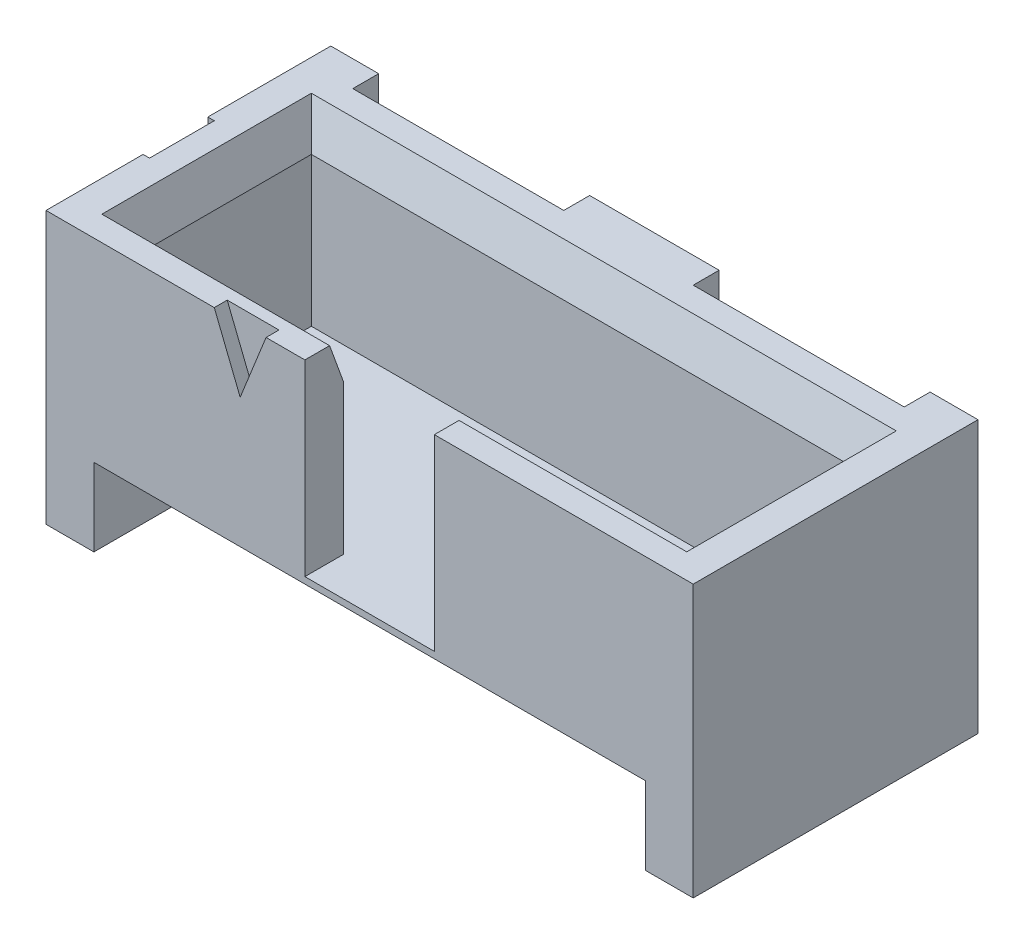
ISO-10303-21;
HEADER;
FILE_DESCRIPTION(('STEP AP214'),'2;1');
FILE_NAME('part.step','',(''),(''),'','','');
FILE_SCHEMA(('AUTOMOTIVE_DESIGN { 1 0 10303 214 1 1 1 1 }'));
ENDSEC;
DATA;
#1=APPLICATION_CONTEXT('core data for automotive mechanical design processes');
#2=APPLICATION_PROTOCOL_DEFINITION('international standard','automotive_design',2000,#1);
#3=PRODUCT_CONTEXT('',#1,'mechanical');
#4=PRODUCT('Part','Part','',(#3));
#5=PRODUCT_RELATED_PRODUCT_CATEGORY('part','',(#4));
#6=PRODUCT_DEFINITION_FORMATION('','',#4);
#7=PRODUCT_DEFINITION_CONTEXT('part definition',#1,'design');
#8=PRODUCT_DEFINITION('design','',#6,#7);
#9=PRODUCT_DEFINITION_SHAPE('','',#8);
#10=(LENGTH_UNIT() NAMED_UNIT(*) SI_UNIT(.MILLI.,.METRE.));
#11=(NAMED_UNIT(*) PLANE_ANGLE_UNIT() SI_UNIT($,.RADIAN.));
#12=(NAMED_UNIT(*) SI_UNIT($,.STERADIAN.) SOLID_ANGLE_UNIT());
#13=UNCERTAINTY_MEASURE_WITH_UNIT(LENGTH_MEASURE(1.E-05),#10,'distance_accuracy_value','');
#14=(GEOMETRIC_REPRESENTATION_CONTEXT(3) GLOBAL_UNCERTAINTY_ASSIGNED_CONTEXT((#13)) GLOBAL_UNIT_ASSIGNED_CONTEXT((#10,
#11,#12)) REPRESENTATION_CONTEXT('',''));
#15=CARTESIAN_POINT('',(0.,0.,0.));
#16=DIRECTION('',(0.,0.,1.));
#17=DIRECTION('',(1.,0.,0.));
#18=AXIS2_PLACEMENT_3D('',#15,#16,#17);
#19=CARTESIAN_POINT('',(-6.35,5.334,2.54));
#20=DIRECTION('',(1.,0.,0.));
#21=DIRECTION('',(0.,0.,-1.));
#22=AXIS2_PLACEMENT_3D('',#19,#20,#21);
#23=PLANE('',#22);
#24=DIRECTION('',(0.,0.,-1.));
#25=VECTOR('',#24,1.);
#26=CARTESIAN_POINT('',(-6.35,5.334,2.54));
#27=LINE('',#26,#25);
#28=CARTESIAN_POINT('',(-6.35,5.334,2.54));
#29=VERTEX_POINT('',#28);
#30=CARTESIAN_POINT('',(-6.35,5.334,0.635));
#31=VERTEX_POINT('',#30);
#32=EDGE_CURVE('E333',#29,#31,#27,.T.);
#33=ORIENTED_EDGE('',*,*,#32,.T.);
#34=DIRECTION('',(0.,-1.,0.));
#35=VECTOR('',#34,1.);
#36=CARTESIAN_POINT('',(-6.35,5.334,0.635));
#37=LINE('',#36,#35);
#38=CARTESIAN_POINT('',(-6.35,0.,0.635));
#39=VERTEX_POINT('',#38);
#40=EDGE_CURVE('E11',#31,#39,#37,.T.);
#41=ORIENTED_EDGE('',*,*,#40,.T.);
#42=DIRECTION('',(0.,0.,-1.));
#43=VECTOR('',#42,1.);
#44=CARTESIAN_POINT('',(-6.35,0.,2.54));
#45=LINE('',#44,#43);
#46=CARTESIAN_POINT('',(-6.35,0.,2.54));
#47=VERTEX_POINT('',#46);
#48=EDGE_CURVE('E329',#47,#39,#45,.T.);
#49=ORIENTED_EDGE('',*,*,#48,.F.);
#50=DIRECTION('',(0.,-1.,0.));
#51=VECTOR('',#50,1.);
#52=CARTESIAN_POINT('',(-6.35,5.334,2.54));
#53=LINE('',#52,#51);
#54=EDGE_CURVE('E310',#29,#47,#53,.T.);
#55=ORIENTED_EDGE('',*,*,#54,.F.);
#56=EDGE_LOOP('',(#33,#41,#49,#55));
#57=FACE_BOUND('',#56,.T.);
#58=ADVANCED_FACE('F33',(#57),#23,.F.);
#59=CARTESIAN_POINT('',(0.,0.,-3.048));
#60=DIRECTION('',(0.,0.,1.));
#61=DIRECTION('',(1.,0.,0.));
#62=AXIS2_PLACEMENT_3D('',#59,#60,#61);
#63=PLANE('',#62);
#64=DIRECTION('',(0.,1.,0.));
#65=VECTOR('',#64,1.);
#66=CARTESIAN_POINT('',(5.4102,0.,-3.048));
#67=LINE('',#66,#65);
#68=CARTESIAN_POINT('',(5.4102,0.,-3.048));
#69=VERTEX_POINT('',#68);
#70=CARTESIAN_POINT('',(5.4102,5.334,-3.048));
#71=VERTEX_POINT('',#70);
#72=EDGE_CURVE('E255',#69,#71,#67,.T.);
#73=ORIENTED_EDGE('',*,*,#72,.T.);
#74=DIRECTION('',(-1.,0.,0.));
#75=VECTOR('',#74,1.);
#76=CARTESIAN_POINT('',(6.35,5.334,-3.048));
#77=LINE('',#76,#75);
#78=CARTESIAN_POINT('',(6.35,5.334,-3.048));
#79=VERTEX_POINT('',#78);
#80=EDGE_CURVE('E260',#79,#71,#77,.T.);
#81=ORIENTED_EDGE('',*,*,#80,.F.);
#82=DIRECTION('',(0.,1.,0.));
#83=VECTOR('',#82,1.);
#84=CARTESIAN_POINT('',(6.35,0.,-3.048));
#85=LINE('',#84,#83);
#86=CARTESIAN_POINT('',(6.35,0.,-3.048));
#87=VERTEX_POINT('',#86);
#88=EDGE_CURVE('E326',#87,#79,#85,.T.);
#89=ORIENTED_EDGE('',*,*,#88,.F.);
#90=DIRECTION('',(1.,0.,0.));
#91=VECTOR('',#90,1.);
#92=CARTESIAN_POINT('',(-6.35,0.,-3.048));
#93=LINE('',#92,#91);
#94=EDGE_CURVE('E261',#69,#87,#93,.T.);
#95=ORIENTED_EDGE('',*,*,#94,.F.);
#96=EDGE_LOOP('',(#73,#81,#89,#95));
#97=FACE_BOUND('',#96,.T.);
#98=ADVANCED_FACE('F257',(#97),#63,.F.);
#99=CARTESIAN_POINT('',(1.27,5.334,-3.048));
#100=VERTEX_POINT('',#99);
#101=CARTESIAN_POINT('',(-1.27,5.334,-3.048));
#102=VERTEX_POINT('',#101);
#103=EDGE_CURVE('E282',#100,#102,#77,.T.);
#104=ORIENTED_EDGE('',*,*,#103,.F.);
#105=DIRECTION('',(0.,-1.,0.));
#106=VECTOR('',#105,1.);
#107=CARTESIAN_POINT('',(1.27,5.334,-3.048));
#108=LINE('',#107,#106);
#109=CARTESIAN_POINT('',(1.27,2.032,-3.048));
#110=VERTEX_POINT('',#109);
#111=EDGE_CURVE('E375',#100,#110,#108,.T.);
#112=ORIENTED_EDGE('',*,*,#111,.T.);
#113=DIRECTION('',(-1.,0.,0.));
#114=VECTOR('',#113,1.);
#115=CARTESIAN_POINT('',(5.4102,2.032,-3.048));
#116=LINE('',#115,#114);
#117=CARTESIAN_POINT('',(-1.27,2.032,-3.048));
#118=VERTEX_POINT('',#117);
#119=EDGE_CURVE('E295',#110,#118,#116,.T.);
#120=ORIENTED_EDGE('',*,*,#119,.T.);
#121=DIRECTION('',(0.,-1.,0.));
#122=VECTOR('',#121,1.);
#123=CARTESIAN_POINT('',(-1.27,5.334,-3.048));
#124=LINE('',#123,#122);
#125=EDGE_CURVE('E373',#102,#118,#124,.T.);
#126=ORIENTED_EDGE('',*,*,#125,.F.);
#127=EDGE_LOOP('',(#104,#112,#120,#126));
#128=FACE_BOUND('',#127,.T.);
#129=ADVANCED_FACE('F537',(#128),#63,.F.);
#130=CARTESIAN_POINT('',(6.35,5.334,2.54));
#131=DIRECTION('',(0.,-1.,0.));
#132=DIRECTION('',(0.,0.,-1.));
#133=AXIS2_PLACEMENT_3D('',#130,#131,#132);
#134=PLANE('',#133);
#135=ORIENTED_EDGE('',*,*,#80,.T.);
#136=DIRECTION('',(0.,0.,1.));
#137=VECTOR('',#136,1.);
#138=CARTESIAN_POINT('',(5.4102,5.334,-3.048));
#139=LINE('',#138,#137);
#140=CARTESIAN_POINT('',(5.4102,5.334,-2.54));
#141=VERTEX_POINT('',#140);
#142=EDGE_CURVE('E267',#71,#141,#139,.T.);
#143=ORIENTED_EDGE('',*,*,#142,.T.);
#144=DIRECTION('',(-1.,0.,0.));
#145=VECTOR('',#144,1.);
#146=CARTESIAN_POINT('',(5.4102,5.334,-2.54));
#147=LINE('',#146,#145);
#148=CARTESIAN_POINT('',(1.27,5.334,-2.54));
#149=VERTEX_POINT('',#148);
#150=EDGE_CURVE('E274',#141,#149,#147,.T.);
#151=ORIENTED_EDGE('',*,*,#150,.T.);
#152=DIRECTION('',(0.,0.,-1.));
#153=VECTOR('',#152,1.);
#154=CARTESIAN_POINT('',(1.27,5.334,-2.54));
#155=LINE('',#154,#153);
#156=EDGE_CURVE('E540',#149,#100,#155,.T.);
#157=ORIENTED_EDGE('',*,*,#156,.T.);
#158=ORIENTED_EDGE('',*,*,#103,.T.);
#159=DIRECTION('',(0.,0.,1.));
#160=VECTOR('',#159,1.);
#161=CARTESIAN_POINT('',(-1.27,5.334,-3.048));
#162=LINE('',#161,#160);
#163=CARTESIAN_POINT('',(-1.27,5.334,-2.54));
#164=VERTEX_POINT('',#163);
#165=EDGE_CURVE('E542',#102,#164,#162,.T.);
#166=ORIENTED_EDGE('',*,*,#165,.T.);
#167=DIRECTION('',(-1.,0.,0.));
#168=VECTOR('',#167,1.);
#169=CARTESIAN_POINT('',(-1.27,5.334,-2.54));
#170=LINE('',#169,#168);
#171=CARTESIAN_POINT('',(-5.4102,5.334,-2.54));
#172=VERTEX_POINT('',#171);
#173=EDGE_CURVE('E353',#164,#172,#170,.T.);
#174=ORIENTED_EDGE('',*,*,#173,.T.);
#175=DIRECTION('',(0.,0.,-1.));
#176=VECTOR('',#175,1.);
#177=CARTESIAN_POINT('',(-5.4102,5.334,-2.54));
#178=LINE('',#177,#176);
#179=CARTESIAN_POINT('',(-5.4102,5.334,-3.048));
#180=VERTEX_POINT('',#179);
#181=EDGE_CURVE('E349',#172,#180,#178,.T.);
#182=ORIENTED_EDGE('',*,*,#181,.T.);
#183=CARTESIAN_POINT('',(-6.35,5.334,-3.048));
#184=VERTEX_POINT('',#183);
#185=EDGE_CURVE('E284',#180,#184,#77,.T.);
#186=ORIENTED_EDGE('',*,*,#185,.T.);
#187=CARTESIAN_POINT('',(-6.35,5.334,-0.635));
#188=VERTEX_POINT('',#187);
#189=EDGE_CURVE('E332',#188,#184,#27,.T.);
#190=ORIENTED_EDGE('',*,*,#189,.F.);
#191=DIRECTION('',(1.,0.,0.));
#192=VECTOR('',#191,1.);
#193=CARTESIAN_POINT('',(-6.604,5.334,-0.635));
#194=LINE('',#193,#192);
#195=CARTESIAN_POINT('',(-6.223,5.334,-0.635));
#196=VERTEX_POINT('',#195);
#197=EDGE_CURVE('E48',#188,#196,#194,.T.);
#198=ORIENTED_EDGE('',*,*,#197,.T.);
#199=DIRECTION('',(0.,0.,1.));
#200=VECTOR('',#199,1.);
#201=CARTESIAN_POINT('',(-6.223,5.334,-0.635));
#202=LINE('',#201,#200);
#203=CARTESIAN_POINT('',(-6.223,5.334,0.635));
#204=VERTEX_POINT('',#203);
#205=EDGE_CURVE('E348',#196,#204,#202,.T.);
#206=ORIENTED_EDGE('',*,*,#205,.T.);
#207=DIRECTION('',(-1.,0.,0.));
#208=VECTOR('',#207,1.);
#209=CARTESIAN_POINT('',(-6.223,5.334,0.635));
#210=LINE('',#209,#208);
#211=EDGE_CURVE('E275',#204,#31,#210,.T.);
#212=ORIENTED_EDGE('',*,*,#211,.T.);
#213=ORIENTED_EDGE('',*,*,#32,.F.);
#214=DIRECTION('',(-1.,0.,0.));
#215=VECTOR('',#214,1.);
#216=CARTESIAN_POINT('',(6.35,5.334,2.54));
#217=LINE('',#216,#215);
#218=CARTESIAN_POINT('',(-3.048,5.334,2.54));
#219=VERTEX_POINT('',#218);
#220=EDGE_CURVE('E312',#219,#29,#217,.T.);
#221=ORIENTED_EDGE('',*,*,#220,.F.);
#222=DIRECTION('',(0.,0.,1.));
#223=VECTOR('',#222,1.);
#224=CARTESIAN_POINT('',(-3.048,5.334,2.286));
#225=LINE('',#224,#223);
#226=CARTESIAN_POINT('',(-3.048,5.334,2.286));
#227=VERTEX_POINT('',#226);
#228=EDGE_CURVE('E423',#227,#219,#225,.T.);
#229=ORIENTED_EDGE('',*,*,#228,.F.);
#230=DIRECTION('',(-1.,0.,0.));
#231=VECTOR('',#230,1.);
#232=CARTESIAN_POINT('',(-2.032,5.334,2.286));
#233=LINE('',#232,#231);
#234=CARTESIAN_POINT('',(-2.032,5.334,2.286));
#235=VERTEX_POINT('',#234);
#236=EDGE_CURVE('E413',#235,#227,#233,.T.);
#237=ORIENTED_EDGE('',*,*,#236,.F.);
#238=DIRECTION('',(0.,0.,1.));
#239=VECTOR('',#238,1.);
#240=CARTESIAN_POINT('',(-2.032,5.334,2.286));
#241=LINE('',#240,#239);
#242=CARTESIAN_POINT('',(-2.032,5.334,2.54));
#243=VERTEX_POINT('',#242);
#244=EDGE_CURVE('E427',#235,#243,#241,.T.);
#245=ORIENTED_EDGE('',*,*,#244,.T.);
#246=CARTESIAN_POINT('',(-1.27,5.334,2.54));
#247=VERTEX_POINT('',#246);
#248=EDGE_CURVE('E311',#247,#243,#217,.T.);
#249=ORIENTED_EDGE('',*,*,#248,.F.);
#250=DIRECTION('',(0.,0.,-1.));
#251=VECTOR('',#250,1.);
#252=CARTESIAN_POINT('',(-1.27,5.334,2.54));
#253=LINE('',#252,#251);
#254=CARTESIAN_POINT('',(-1.27,5.334,2.05534531851085));
#255=VERTEX_POINT('',#254);
#256=EDGE_CURVE('E447',#247,#255,#253,.T.);
#257=ORIENTED_EDGE('',*,*,#256,.T.);
#258=DIRECTION('',(-1.,0.,0.));
#259=VECTOR('',#258,1.);
#260=CARTESIAN_POINT('',(-5.461,5.334,2.05534531851085));
#261=LINE('',#260,#259);
#262=CARTESIAN_POINT('',(-5.73834531851085,5.334,2.05534531851085));
#263=VERTEX_POINT('',#262);
#264=EDGE_CURVE('E484',#263,#255,#261,.F.);
#265=ORIENTED_EDGE('',*,*,#264,.F.);
#266=DIRECTION('',(0.,0.,-1.));
#267=VECTOR('',#266,1.);
#268=CARTESIAN_POINT('',(-5.73834531851085,5.334,-1.778));
#269=LINE('',#268,#267);
#270=CARTESIAN_POINT('',(-5.73834531851085,5.334,-2.05534531851085));
#271=VERTEX_POINT('',#270);
#272=EDGE_CURVE('E481',#271,#263,#269,.F.);
#273=ORIENTED_EDGE('',*,*,#272,.F.);
#274=DIRECTION('',(1.,0.,0.));
#275=VECTOR('',#274,1.);
#276=CARTESIAN_POINT('',(5.461,5.334,-2.05534531851085));
#277=LINE('',#276,#275);
#278=CARTESIAN_POINT('',(5.73834531851085,5.334,-2.05534531851085));
#279=VERTEX_POINT('',#278);
#280=EDGE_CURVE('E465',#279,#271,#277,.F.);
#281=ORIENTED_EDGE('',*,*,#280,.F.);
#282=DIRECTION('',(0.,0.,1.));
#283=VECTOR('',#282,1.);
#284=CARTESIAN_POINT('',(5.73834531851085,5.334,1.778));
#285=LINE('',#284,#283);
#286=CARTESIAN_POINT('',(5.73834531851085,5.334,2.05534531851085));
#287=VERTEX_POINT('',#286);
#288=EDGE_CURVE('E475',#287,#279,#285,.F.);
#289=ORIENTED_EDGE('',*,*,#288,.F.);
#290=CARTESIAN_POINT('',(1.27,5.334,2.05534531851085));
#291=VERTEX_POINT('',#290);
#292=EDGE_CURVE('E483',#291,#287,#261,.F.);
#293=ORIENTED_EDGE('',*,*,#292,.F.);
#294=DIRECTION('',(0.,0.,-1.));
#295=VECTOR('',#294,1.);
#296=CARTESIAN_POINT('',(1.27,5.334,2.54));
#297=LINE('',#296,#295);
#298=CARTESIAN_POINT('',(1.27,5.334,2.54));
#299=VERTEX_POINT('',#298);
#300=EDGE_CURVE('E439',#299,#291,#297,.T.);
#301=ORIENTED_EDGE('',*,*,#300,.F.);
#302=CARTESIAN_POINT('',(6.35,5.334,2.54));
#303=VERTEX_POINT('',#302);
#304=EDGE_CURVE('E307',#303,#299,#217,.T.);
#305=ORIENTED_EDGE('',*,*,#304,.F.);
#306=DIRECTION('',(0.,0.,-1.));
#307=VECTOR('',#306,1.);
#308=CARTESIAN_POINT('',(6.35,5.334,2.54));
#309=LINE('',#308,#307);
#310=EDGE_CURVE('E280',#303,#79,#309,.T.);
#311=ORIENTED_EDGE('',*,*,#310,.T.);
#312=EDGE_LOOP('',(#135,#143,#151,#157,#158,#166,#174,#182,#186,#190,#198,#206,#212,#213,#221,
#229,#237,#245,#249,#257,#265,#273,#281,#289,#293,#301,#305,#311));
#313=FACE_BOUND('',#312,.T.);
#314=ADVANCED_FACE('F35',(#313),#134,.F.);
#315=CARTESIAN_POINT('',(0.,0.,2.54));
#316=DIRECTION('',(0.,0.,1.));
#317=DIRECTION('',(1.,0.,0.));
#318=AXIS2_PLACEMENT_3D('',#315,#316,#317);
#319=PLANE('',#318);
#320=DIRECTION('',(0.371390676354104,0.928476690885259,0.));
#321=VECTOR('',#320,1.);
#322=CARTESIAN_POINT('',(-2.54,4.064,2.54));
#323=LINE('',#322,#321);
#324=CARTESIAN_POINT('',(-2.54,4.064,2.54));
#325=VERTEX_POINT('',#324);
#326=EDGE_CURVE('E417',#325,#243,#323,.T.);
#327=ORIENTED_EDGE('',*,*,#326,.F.);
#328=DIRECTION('',(0.371390676354103,-0.928476690885259,0.));
#329=VECTOR('',#328,1.);
#330=CARTESIAN_POINT('',(-3.048,5.334,2.54));
#331=LINE('',#330,#329);
#332=EDGE_CURVE('E412',#219,#325,#331,.T.);
#333=ORIENTED_EDGE('',*,*,#332,.F.);
#334=ORIENTED_EDGE('',*,*,#220,.T.);
#335=ORIENTED_EDGE('',*,*,#54,.T.);
#336=DIRECTION('',(1.,0.,0.));
#337=VECTOR('',#336,1.);
#338=CARTESIAN_POINT('',(-6.35,0.,2.54));
#339=LINE('',#338,#337);
#340=CARTESIAN_POINT('',(-5.4102,0.,2.54));
#341=VERTEX_POINT('',#340);
#342=EDGE_CURVE('E315',#47,#341,#339,.T.);
#343=ORIENTED_EDGE('',*,*,#342,.T.);
#344=DIRECTION('',(0.,-1.,0.));
#345=VECTOR('',#344,1.);
#346=CARTESIAN_POINT('',(-5.4102,1.524,2.54));
#347=LINE('',#346,#345);
#348=CARTESIAN_POINT('',(-5.4102,1.524,2.54));
#349=VERTEX_POINT('',#348);
#350=EDGE_CURVE('E489',#349,#341,#347,.T.);
#351=ORIENTED_EDGE('',*,*,#350,.F.);
#352=DIRECTION('',(-1.,0.,0.));
#353=VECTOR('',#352,1.);
#354=CARTESIAN_POINT('',(5.4102,1.524,2.54));
#355=LINE('',#354,#353);
#356=CARTESIAN_POINT('',(5.4102,1.524,2.54));
#357=VERTEX_POINT('',#356);
#358=EDGE_CURVE('E290',#357,#349,#355,.T.);
#359=ORIENTED_EDGE('',*,*,#358,.F.);
#360=DIRECTION('',(0.,-1.,0.));
#361=VECTOR('',#360,1.);
#362=CARTESIAN_POINT('',(5.4102,1.524,2.54));
#363=LINE('',#362,#361);
#364=CARTESIAN_POINT('',(5.4102,0.,2.54));
#365=VERTEX_POINT('',#364);
#366=EDGE_CURVE('E502',#357,#365,#363,.T.);
#367=ORIENTED_EDGE('',*,*,#366,.T.);
#368=CARTESIAN_POINT('',(6.35,0.,2.54));
#369=VERTEX_POINT('',#368);
#370=EDGE_CURVE('E314',#365,#369,#339,.T.);
#371=ORIENTED_EDGE('',*,*,#370,.T.);
#372=DIRECTION('',(0.,1.,0.));
#373=VECTOR('',#372,1.);
#374=CARTESIAN_POINT('',(6.35,0.,2.54));
#375=LINE('',#374,#373);
#376=EDGE_CURVE('E317',#369,#303,#375,.T.);
#377=ORIENTED_EDGE('',*,*,#376,.T.);
#378=ORIENTED_EDGE('',*,*,#304,.T.);
#379=DIRECTION('',(0.,1.,0.));
#380=VECTOR('',#379,1.);
#381=CARTESIAN_POINT('',(1.27,1.651,2.54));
#382=LINE('',#381,#380);
#383=CARTESIAN_POINT('',(1.27,1.651,2.54));
#384=VERTEX_POINT('',#383);
#385=EDGE_CURVE('E437',#384,#299,#382,.T.);
#386=ORIENTED_EDGE('',*,*,#385,.F.);
#387=DIRECTION('',(1.,0.,0.));
#388=VECTOR('',#387,1.);
#389=CARTESIAN_POINT('',(-1.27,1.651,2.54));
#390=LINE('',#389,#388);
#391=CARTESIAN_POINT('',(-1.27,1.651,2.54));
#392=VERTEX_POINT('',#391);
#393=EDGE_CURVE('E435',#392,#384,#390,.T.);
#394=ORIENTED_EDGE('',*,*,#393,.F.);
#395=DIRECTION('',(0.,-1.,0.));
#396=VECTOR('',#395,1.);
#397=CARTESIAN_POINT('',(-1.27,5.334,2.54));
#398=LINE('',#397,#396);
#399=EDGE_CURVE('E430',#247,#392,#398,.T.);
#400=ORIENTED_EDGE('',*,*,#399,.F.);
#401=ORIENTED_EDGE('',*,*,#248,.T.);
#402=EDGE_LOOP('',(#327,#333,#334,#335,#343,#351,#359,#367,#371,#377,#378,#386,#394,#400,#401));
#403=FACE_BOUND('',#402,.T.);
#404=ADVANCED_FACE('F589',(#403),#319,.T.);
#405=CARTESIAN_POINT('',(-5.461,4.572,1.778));
#406=DIRECTION('',(0.,-0.342020143325673,0.939692620785907));
#407=DIRECTION('',(0.,-0.939692620785907,-0.342020143325673));
#408=AXIS2_PLACEMENT_3D('',#405,#406,#407);
#409=PLANE('',#408);
#410=ORIENTED_EDGE('',*,*,#264,.T.);
#411=DIRECTION('',(0.,0.939692620785907,0.342020143325673));
#412=VECTOR('',#411,1.);
#413=CARTESIAN_POINT('',(-1.27,4.572,1.778));
#414=LINE('',#413,#412);
#415=CARTESIAN_POINT('',(-1.27,4.572,1.778));
#416=VERTEX_POINT('',#415);
#417=EDGE_CURVE('E453',#255,#416,#414,.F.);
#418=ORIENTED_EDGE('',*,*,#417,.T.);
#419=DIRECTION('',(1.,0.,0.));
#420=VECTOR('',#419,1.);
#421=CARTESIAN_POINT('',(-5.461,4.572,1.778));
#422=LINE('',#421,#420);
#423=CARTESIAN_POINT('',(-5.461,4.572,1.778));
#424=VERTEX_POINT('',#423);
#425=EDGE_CURVE('E461',#424,#416,#422,.T.);
#426=ORIENTED_EDGE('',*,*,#425,.F.);
#427=DIRECTION('',(0.323615577118188,-0.889126490715986,-0.323615577118188));
#428=VECTOR('',#427,1.);
#429=CARTESIAN_POINT('',(-5.461,4.572,1.778));
#430=LINE('',#429,#428);
#431=EDGE_CURVE('E470',#263,#424,#430,.T.);
#432=ORIENTED_EDGE('',*,*,#431,.F.);
#433=EDGE_LOOP('',(#410,#418,#426,#432));
#434=FACE_BOUND('',#433,.T.);
#435=ADVANCED_FACE('F579',(#434),#409,.F.);
#436=CARTESIAN_POINT('',(1.27,4.572,1.778));
#437=VERTEX_POINT('',#436);
#438=CARTESIAN_POINT('',(5.461,4.572,1.778));
#439=VERTEX_POINT('',#438);
#440=EDGE_CURVE('E460',#437,#439,#422,.T.);
#441=ORIENTED_EDGE('',*,*,#440,.F.);
#442=DIRECTION('',(0.,-0.939692620785907,-0.342020143325673));
#443=VECTOR('',#442,1.);
#444=CARTESIAN_POINT('',(1.27,4.572,1.778));
#445=LINE('',#444,#443);
#446=EDGE_CURVE('E450',#437,#291,#445,.F.);
#447=ORIENTED_EDGE('',*,*,#446,.T.);
#448=ORIENTED_EDGE('',*,*,#292,.T.);
#449=DIRECTION('',(-0.323615577118188,-0.889126490715986,-0.323615577118188));
#450=VECTOR('',#449,1.);
#451=CARTESIAN_POINT('',(5.461,4.572,1.778));
#452=LINE('',#451,#450);
#453=EDGE_CURVE('E474',#287,#439,#452,.T.);
#454=ORIENTED_EDGE('',*,*,#453,.T.);
#455=EDGE_LOOP('',(#441,#447,#448,#454));
#456=FACE_BOUND('',#455,.T.);
#457=ADVANCED_FACE('F574',(#456),#409,.F.);
#458=CARTESIAN_POINT('',(-6.35,0.,2.54));
#459=DIRECTION('',(0.,1.,0.));
#460=DIRECTION('',(0.,0.,1.));
#461=AXIS2_PLACEMENT_3D('',#458,#459,#460);
#462=PLANE('',#461);
#463=ORIENTED_EDGE('',*,*,#48,.T.);
#464=DIRECTION('',(-1.,0.,0.));
#465=VECTOR('',#464,1.);
#466=CARTESIAN_POINT('',(-6.223,0.,0.635));
#467=LINE('',#466,#465);
#468=CARTESIAN_POINT('',(-6.223,0.,0.635));
#469=VERTEX_POINT('',#468);
#470=EDGE_CURVE('E357',#469,#39,#467,.T.);
#471=ORIENTED_EDGE('',*,*,#470,.F.);
#472=DIRECTION('',(0.,0.,1.));
#473=VECTOR('',#472,1.);
#474=CARTESIAN_POINT('',(-6.223,0.,-0.635));
#475=LINE('',#474,#473);
#476=CARTESIAN_POINT('',(-6.223,0.,-0.635));
#477=VERTEX_POINT('',#476);
#478=EDGE_CURVE('E361',#477,#469,#475,.T.);
#479=ORIENTED_EDGE('',*,*,#478,.F.);
#480=DIRECTION('',(1.,0.,0.));
#481=VECTOR('',#480,1.);
#482=CARTESIAN_POINT('',(-6.604,0.,-0.635));
#483=LINE('',#482,#481);
#484=CARTESIAN_POINT('',(-6.35,0.,-0.635));
#485=VERTEX_POINT('',#484);
#486=EDGE_CURVE('E359',#485,#477,#483,.T.);
#487=ORIENTED_EDGE('',*,*,#486,.F.);
#488=CARTESIAN_POINT('',(-6.35,0.,-3.048));
#489=VERTEX_POINT('',#488);
#490=EDGE_CURVE('E323',#485,#489,#45,.T.);
#491=ORIENTED_EDGE('',*,*,#490,.T.);
#492=CARTESIAN_POINT('',(-5.4102,0.,-3.048));
#493=VERTEX_POINT('',#492);
#494=EDGE_CURVE('E673',#489,#493,#93,.T.);
#495=ORIENTED_EDGE('',*,*,#494,.T.);
#496=DIRECTION('',(0.,0.,-1.));
#497=VECTOR('',#496,1.);
#498=CARTESIAN_POINT('',(-5.4102,0.,2.54));
#499=LINE('',#498,#497);
#500=EDGE_CURVE('E491',#341,#493,#499,.T.);
#501=ORIENTED_EDGE('',*,*,#500,.F.);
#502=ORIENTED_EDGE('',*,*,#342,.F.);
#503=EDGE_LOOP('',(#463,#471,#479,#487,#491,#495,#501,#502));
#504=FACE_BOUND('',#503,.T.);
#505=ADVANCED_FACE('F567',(#504),#462,.F.);
#506=ORIENTED_EDGE('',*,*,#490,.F.);
#507=DIRECTION('',(0.,1.,0.));
#508=VECTOR('',#507,1.);
#509=CARTESIAN_POINT('',(-6.35,5.334,-0.635));
#510=LINE('',#509,#508);
#511=EDGE_CURVE('E41',#485,#188,#510,.T.);
#512=ORIENTED_EDGE('',*,*,#511,.T.);
#513=ORIENTED_EDGE('',*,*,#189,.T.);
#514=DIRECTION('',(0.,-1.,0.));
#515=VECTOR('',#514,1.);
#516=CARTESIAN_POINT('',(-6.35,5.334,-3.048));
#517=LINE('',#516,#515);
#518=EDGE_CURVE('E281',#184,#489,#517,.T.);
#519=ORIENTED_EDGE('',*,*,#518,.T.);
#520=EDGE_LOOP('',(#506,#512,#513,#519));
#521=FACE_BOUND('',#520,.T.);
#522=ADVANCED_FACE('F343',(#521),#23,.F.);
#523=ORIENTED_EDGE('',*,*,#370,.F.);
#524=DIRECTION('',(0.,0.,-1.));
#525=VECTOR('',#524,1.);
#526=CARTESIAN_POINT('',(5.4102,0.,2.54));
#527=LINE('',#526,#525);
#528=EDGE_CURVE('E264',#365,#69,#527,.T.);
#529=ORIENTED_EDGE('',*,*,#528,.T.);
#530=ORIENTED_EDGE('',*,*,#94,.T.);
#531=DIRECTION('',(0.,0.,-1.));
#532=VECTOR('',#531,1.);
#533=CARTESIAN_POINT('',(6.35,0.,2.54));
#534=LINE('',#533,#532);
#535=EDGE_CURVE('E320',#369,#87,#534,.T.);
#536=ORIENTED_EDGE('',*,*,#535,.F.);
#537=EDGE_LOOP('',(#523,#529,#530,#536));
#538=FACE_BOUND('',#537,.T.);
#539=ADVANCED_FACE('F566',(#538),#462,.F.);
#540=CARTESIAN_POINT('',(6.35,0.,2.54));
#541=DIRECTION('',(-1.,0.,0.));
#542=DIRECTION('',(0.,0.,1.));
#543=AXIS2_PLACEMENT_3D('',#540,#541,#542);
#544=PLANE('',#543);
#545=ORIENTED_EDGE('',*,*,#88,.T.);
#546=ORIENTED_EDGE('',*,*,#310,.F.);
#547=ORIENTED_EDGE('',*,*,#376,.F.);
#548=ORIENTED_EDGE('',*,*,#535,.T.);
#549=EDGE_LOOP('',(#545,#546,#547,#548));
#550=FACE_BOUND('',#549,.T.);
#551=ADVANCED_FACE('F572',(#550),#544,.F.);
#552=ORIENTED_EDGE('',*,*,#185,.F.);
#553=DIRECTION('',(0.,1.,0.));
#554=VECTOR('',#553,1.);
#555=CARTESIAN_POINT('',(-5.4102,0.,-3.048));
#556=LINE('',#555,#554);
#557=EDGE_CURVE('E493',#493,#180,#556,.T.);
#558=ORIENTED_EDGE('',*,*,#557,.F.);
#559=ORIENTED_EDGE('',*,*,#494,.F.);
#560=ORIENTED_EDGE('',*,*,#518,.F.);
#561=EDGE_LOOP('',(#552,#558,#559,#560));
#562=FACE_BOUND('',#561,.T.);
#563=ADVANCED_FACE('F563',(#562),#63,.F.);
#564=CARTESIAN_POINT('',(5.4102,0.508,1.524));
#565=DIRECTION('',(0.,-0.707106781186548,0.707106781186547));
#566=DIRECTION('',(0.,-0.707106781186547,-0.707106781186548));
#567=AXIS2_PLACEMENT_3D('',#564,#565,#566);
#568=PLANE('',#567);
#569=DIRECTION('',(-1.,0.,0.));
#570=VECTOR('',#569,1.);
#571=CARTESIAN_POINT('',(5.4102,0.508,1.524));
#572=LINE('',#571,#570);
#573=CARTESIAN_POINT('',(5.4102,0.508,1.524));
#574=VERTEX_POINT('',#573);
#575=CARTESIAN_POINT('',(-5.4102,0.508,1.524));
#576=VERTEX_POINT('',#575);
#577=EDGE_CURVE('E509',#574,#576,#572,.T.);
#578=ORIENTED_EDGE('',*,*,#577,.F.);
#579=DIRECTION('',(0.,0.707106781186547,0.707106781186548));
#580=VECTOR('',#579,1.);
#581=CARTESIAN_POINT('',(5.4102,0.508,1.524));
#582=LINE('',#581,#580);
#583=EDGE_CURVE('E500',#574,#357,#582,.T.);
#584=ORIENTED_EDGE('',*,*,#583,.T.);
#585=ORIENTED_EDGE('',*,*,#358,.T.);
#586=DIRECTION('',(0.,0.707106781186547,0.707106781186548));
#587=VECTOR('',#586,1.);
#588=CARTESIAN_POINT('',(-5.4102,0.508,1.524));
#589=LINE('',#588,#587);
#590=EDGE_CURVE('E469',#576,#349,#589,.T.);
#591=ORIENTED_EDGE('',*,*,#590,.F.);
#592=EDGE_LOOP('',(#578,#584,#585,#591));
#593=FACE_BOUND('',#592,.T.);
#594=ADVANCED_FACE('F587',(#593),#568,.T.);
#595=CARTESIAN_POINT('',(5.4102,2.032,-3.048));
#596=DIRECTION('',(0.,-0.707106781186548,-0.707106781186548));
#597=DIRECTION('',(0.,0.707106781186548,-0.707106781186548));
#598=AXIS2_PLACEMENT_3D('',#595,#596,#597);
#599=PLANE('',#598);
#600=DIRECTION('',(-1.,0.,0.));
#601=VECTOR('',#600,1.);
#602=CARTESIAN_POINT('',(5.4102,1.524,-2.54));
#603=LINE('',#602,#601);
#604=CARTESIAN_POINT('',(5.4102,1.524,-2.54));
#605=VERTEX_POINT('',#604);
#606=CARTESIAN_POINT('',(1.27,1.524,-2.54));
#607=VERTEX_POINT('',#606);
#608=EDGE_CURVE('E383',#605,#607,#603,.T.);
#609=ORIENTED_EDGE('',*,*,#608,.F.);
#610=DIRECTION('',(0.,-0.707106781186547,0.707106781186547));
#611=VECTOR('',#610,1.);
#612=CARTESIAN_POINT('',(5.4102,2.032,-3.048));
#613=LINE('',#612,#611);
#614=CARTESIAN_POINT('',(5.4102,0.508,-1.524));
#615=VERTEX_POINT('',#614);
#616=EDGE_CURVE('E263',#605,#615,#613,.T.);
#617=ORIENTED_EDGE('',*,*,#616,.T.);
#618=DIRECTION('',(-1.,0.,0.));
#619=VECTOR('',#618,1.);
#620=CARTESIAN_POINT('',(5.4102,0.508,-1.524));
#621=LINE('',#620,#619);
#622=CARTESIAN_POINT('',(-5.4102,0.508,-1.524));
#623=VERTEX_POINT('',#622);
#624=EDGE_CURVE('E303',#615,#623,#621,.T.);
#625=ORIENTED_EDGE('',*,*,#624,.T.);
#626=DIRECTION('',(0.,-0.707106781186547,0.707106781186547));
#627=VECTOR('',#626,1.);
#628=CARTESIAN_POINT('',(-5.4102,2.032,-3.048));
#629=LINE('',#628,#627);
#630=CARTESIAN_POINT('',(-5.4102,1.524,-2.54));
#631=VERTEX_POINT('',#630);
#632=EDGE_CURVE('E495',#631,#623,#629,.T.);
#633=ORIENTED_EDGE('',*,*,#632,.F.);
#634=DIRECTION('',(-1.,0.,0.));
#635=VECTOR('',#634,1.);
#636=CARTESIAN_POINT('',(5.4102,1.524,-2.54));
#637=LINE('',#636,#635);
#638=CARTESIAN_POINT('',(-1.27,1.524,-2.54));
#639=VERTEX_POINT('',#638);
#640=EDGE_CURVE('E380',#639,#631,#637,.T.);
#641=ORIENTED_EDGE('',*,*,#640,.F.);
#642=DIRECTION('',(0.,-0.707106781186548,0.707106781186548));
#643=VECTOR('',#642,1.);
#644=CARTESIAN_POINT('',(-1.27,2.032,-3.048));
#645=LINE('',#644,#643);
#646=EDGE_CURVE('E338',#118,#639,#645,.T.);
#647=ORIENTED_EDGE('',*,*,#646,.F.);
#648=ORIENTED_EDGE('',*,*,#119,.F.);
#649=DIRECTION('',(0.,0.707106781186548,-0.707106781186548));
#650=VECTOR('',#649,1.);
#651=CARTESIAN_POINT('',(1.27,2.032,-3.048));
#652=LINE('',#651,#650);
#653=EDGE_CURVE('E340',#607,#110,#652,.T.);
#654=ORIENTED_EDGE('',*,*,#653,.F.);
#655=EDGE_LOOP('',(#609,#617,#625,#633,#641,#647,#648,#654));
#656=FACE_BOUND('',#655,.T.);
#657=ADVANCED_FACE('F516',(#656),#599,.T.);
#658=CARTESIAN_POINT('',(5.4102,0.508,-1.524));
#659=DIRECTION('',(0.,-1.,0.));
#660=DIRECTION('',(0.,0.,-1.));
#661=AXIS2_PLACEMENT_3D('',#658,#659,#660);
#662=PLANE('',#661);
#663=ORIENTED_EDGE('',*,*,#624,.F.);
#664=DIRECTION('',(0.,0.,1.));
#665=VECTOR('',#664,1.);
#666=CARTESIAN_POINT('',(5.4102,0.508,-1.524));
#667=LINE('',#666,#665);
#668=EDGE_CURVE('E507',#615,#574,#667,.T.);
#669=ORIENTED_EDGE('',*,*,#668,.T.);
#670=ORIENTED_EDGE('',*,*,#577,.T.);
#671=DIRECTION('',(0.,0.,1.));
#672=VECTOR('',#671,1.);
#673=CARTESIAN_POINT('',(-5.4102,0.508,-1.524));
#674=LINE('',#673,#672);
#675=EDGE_CURVE('E497',#623,#576,#674,.T.);
#676=ORIENTED_EDGE('',*,*,#675,.F.);
#677=EDGE_LOOP('',(#663,#669,#670,#676));
#678=FACE_BOUND('',#677,.T.);
#679=ADVANCED_FACE('F520',(#678),#662,.T.);
#680=CARTESIAN_POINT('',(5.4102,0.,0.));
#681=DIRECTION('',(1.,0.,0.));
#682=DIRECTION('',(0.,0.,-1.));
#683=AXIS2_PLACEMENT_3D('',#680,#681,#682);
#684=PLANE('',#683);
#685=ORIENTED_EDGE('',*,*,#616,.F.);
#686=DIRECTION('',(0.,-1.,0.));
#687=VECTOR('',#686,1.);
#688=CARTESIAN_POINT('',(5.4102,5.334,-2.54));
#689=LINE('',#688,#687);
#690=EDGE_CURVE('E270',#141,#605,#689,.T.);
#691=ORIENTED_EDGE('',*,*,#690,.F.);
#692=ORIENTED_EDGE('',*,*,#142,.F.);
#693=ORIENTED_EDGE('',*,*,#72,.F.);
#694=ORIENTED_EDGE('',*,*,#528,.F.);
#695=ORIENTED_EDGE('',*,*,#366,.F.);
#696=ORIENTED_EDGE('',*,*,#583,.F.);
#697=ORIENTED_EDGE('',*,*,#668,.F.);
#698=EDGE_LOOP('',(#685,#691,#692,#693,#694,#695,#696,#697));
#699=FACE_BOUND('',#698,.T.);
#700=ADVANCED_FACE('F269',(#699),#684,.F.);
#701=CARTESIAN_POINT('',(-5.4102,0.,0.));
#702=DIRECTION('',(1.,0.,0.));
#703=DIRECTION('',(0.,0.,-1.));
#704=AXIS2_PLACEMENT_3D('',#701,#702,#703);
#705=PLANE('',#704);
#706=ORIENTED_EDGE('',*,*,#500,.T.);
#707=ORIENTED_EDGE('',*,*,#557,.T.);
#708=ORIENTED_EDGE('',*,*,#181,.F.);
#709=DIRECTION('',(0.,-1.,0.));
#710=VECTOR('',#709,1.);
#711=CARTESIAN_POINT('',(-5.4102,5.334,-2.54));
#712=LINE('',#711,#710);
#713=EDGE_CURVE('E368',#172,#631,#712,.T.);
#714=ORIENTED_EDGE('',*,*,#713,.T.);
#715=ORIENTED_EDGE('',*,*,#632,.T.);
#716=ORIENTED_EDGE('',*,*,#675,.T.);
#717=ORIENTED_EDGE('',*,*,#590,.T.);
#718=ORIENTED_EDGE('',*,*,#350,.T.);
#719=EDGE_LOOP('',(#706,#707,#708,#714,#715,#716,#717,#718));
#720=FACE_BOUND('',#719,.T.);
#721=ADVANCED_FACE('F523',(#720),#705,.T.);
#722=CARTESIAN_POINT('',(5.461,4.572,-1.778));
#723=DIRECTION('',(0.,-0.342020143325673,-0.939692620785907));
#724=DIRECTION('',(0.,0.939692620785907,-0.342020143325673));
#725=AXIS2_PLACEMENT_3D('',#722,#723,#724);
#726=PLANE('',#725);
#727=DIRECTION('',(-1.,0.,0.));
#728=VECTOR('',#727,1.);
#729=CARTESIAN_POINT('',(5.461,4.572,-1.778));
#730=LINE('',#729,#728);
#731=CARTESIAN_POINT('',(5.461,4.572,-1.778));
#732=VERTEX_POINT('',#731);
#733=CARTESIAN_POINT('',(-5.461,4.572,-1.778));
#734=VERTEX_POINT('',#733);
#735=EDGE_CURVE('E456',#732,#734,#730,.T.);
#736=ORIENTED_EDGE('',*,*,#735,.F.);
#737=DIRECTION('',(-0.323615577118188,-0.889126490715986,0.323615577118188));
#738=VECTOR('',#737,1.);
#739=CARTESIAN_POINT('',(5.461,4.572,-1.778));
#740=LINE('',#739,#738);
#741=EDGE_CURVE('E471',#279,#732,#740,.T.);
#742=ORIENTED_EDGE('',*,*,#741,.F.);
#743=ORIENTED_EDGE('',*,*,#280,.T.);
#744=DIRECTION('',(0.323615577118188,-0.889126490715986,0.323615577118188));
#745=VECTOR('',#744,1.);
#746=CARTESIAN_POINT('',(-5.461,4.572,-1.778));
#747=LINE('',#746,#745);
#748=EDGE_CURVE('E466',#271,#734,#747,.T.);
#749=ORIENTED_EDGE('',*,*,#748,.T.);
#750=EDGE_LOOP('',(#736,#742,#743,#749));
#751=FACE_BOUND('',#750,.T.);
#752=ADVANCED_FACE('F602',(#751),#726,.F.);
#753=CARTESIAN_POINT('',(-5.461,4.572,-1.778));
#754=DIRECTION('',(-0.939692620785907,-0.342020143325673,0.));
#755=DIRECTION('',(0.342020143325673,-0.939692620785907,0.));
#756=AXIS2_PLACEMENT_3D('',#753,#754,#755);
#757=PLANE('',#756);
#758=DIRECTION('',(0.,0.,1.));
#759=VECTOR('',#758,1.);
#760=CARTESIAN_POINT('',(-5.461,4.572,-1.778));
#761=LINE('',#760,#759);
#762=EDGE_CURVE('E458',#734,#424,#761,.T.);
#763=ORIENTED_EDGE('',*,*,#762,.F.);
#764=ORIENTED_EDGE('',*,*,#748,.F.);
#765=ORIENTED_EDGE('',*,*,#272,.T.);
#766=ORIENTED_EDGE('',*,*,#431,.T.);
#767=EDGE_LOOP('',(#763,#764,#765,#766));
#768=FACE_BOUND('',#767,.T.);
#769=ADVANCED_FACE('F603',(#768),#757,.F.);
#770=CARTESIAN_POINT('',(5.461,4.572,1.778));
#771=DIRECTION('',(0.939692620785907,-0.342020143325673,0.));
#772=DIRECTION('',(0.342020143325673,0.939692620785907,0.));
#773=AXIS2_PLACEMENT_3D('',#770,#771,#772);
#774=PLANE('',#773);
#775=DIRECTION('',(0.,0.,-1.));
#776=VECTOR('',#775,1.);
#777=CARTESIAN_POINT('',(5.461,4.572,1.778));
#778=LINE('',#777,#776);
#779=EDGE_CURVE('E463',#439,#732,#778,.T.);
#780=ORIENTED_EDGE('',*,*,#779,.F.);
#781=ORIENTED_EDGE('',*,*,#453,.F.);
#782=ORIENTED_EDGE('',*,*,#288,.T.);
#783=ORIENTED_EDGE('',*,*,#741,.T.);
#784=EDGE_LOOP('',(#780,#781,#782,#783));
#785=FACE_BOUND('',#784,.T.);
#786=ADVANCED_FACE('F605',(#785),#774,.F.);
#787=CARTESIAN_POINT('',(-1.27,5.334,2.54));
#788=DIRECTION('',(1.,0.,0.));
#789=DIRECTION('',(0.,0.,-1.));
#790=AXIS2_PLACEMENT_3D('',#787,#788,#789);
#791=PLANE('',#790);
#792=DIRECTION('',(0.,-1.,0.));
#793=VECTOR('',#792,1.);
#794=CARTESIAN_POINT('',(-1.27,5.334,1.778));
#795=LINE('',#794,#793);
#796=CARTESIAN_POINT('',(-1.27,1.651,1.778));
#797=VERTEX_POINT('',#796);
#798=EDGE_CURVE('E402',#416,#797,#795,.T.);
#799=ORIENTED_EDGE('',*,*,#798,.F.);
#800=ORIENTED_EDGE('',*,*,#417,.F.);
#801=ORIENTED_EDGE('',*,*,#256,.F.);
#802=ORIENTED_EDGE('',*,*,#399,.T.);
#803=DIRECTION('',(0.,0.,-1.));
#804=VECTOR('',#803,1.);
#805=CARTESIAN_POINT('',(-1.27,1.651,2.54));
#806=LINE('',#805,#804);
#807=EDGE_CURVE('E444',#392,#797,#806,.T.);
#808=ORIENTED_EDGE('',*,*,#807,.T.);
#809=EDGE_LOOP('',(#799,#800,#801,#802,#808));
#810=FACE_BOUND('',#809,.T.);
#811=ADVANCED_FACE('F612',(#810),#791,.T.);
#812=CARTESIAN_POINT('',(-1.27,1.651,2.54));
#813=DIRECTION('',(0.,1.,0.));
#814=DIRECTION('',(0.,0.,1.));
#815=AXIS2_PLACEMENT_3D('',#812,#813,#814);
#816=PLANE('',#815);
#817=DIRECTION('',(1.,0.,0.));
#818=VECTOR('',#817,1.);
#819=CARTESIAN_POINT('',(-5.461,1.651,1.778));
#820=LINE('',#819,#818);
#821=CARTESIAN_POINT('',(-5.461,1.651,1.778));
#822=VERTEX_POINT('',#821);
#823=EDGE_CURVE('E392',#822,#797,#820,.T.);
#824=ORIENTED_EDGE('',*,*,#823,.T.);
#825=ORIENTED_EDGE('',*,*,#807,.F.);
#826=ORIENTED_EDGE('',*,*,#393,.T.);
#827=DIRECTION('',(0.,0.,-1.));
#828=VECTOR('',#827,1.);
#829=CARTESIAN_POINT('',(1.27,1.651,2.54));
#830=LINE('',#829,#828);
#831=CARTESIAN_POINT('',(1.27,1.651,1.778));
#832=VERTEX_POINT('',#831);
#833=EDGE_CURVE('E441',#384,#832,#830,.T.);
#834=ORIENTED_EDGE('',*,*,#833,.T.);
#835=CARTESIAN_POINT('',(5.461,1.651,1.778));
#836=VERTEX_POINT('',#835);
#837=EDGE_CURVE('E391',#832,#836,#820,.T.);
#838=ORIENTED_EDGE('',*,*,#837,.T.);
#839=DIRECTION('',(0.,0.,-1.));
#840=VECTOR('',#839,1.);
#841=CARTESIAN_POINT('',(5.461,1.651,1.778));
#842=LINE('',#841,#840);
#843=CARTESIAN_POINT('',(5.461,1.651,-1.778));
#844=VERTEX_POINT('',#843);
#845=EDGE_CURVE('E395',#836,#844,#842,.T.);
#846=ORIENTED_EDGE('',*,*,#845,.T.);
#847=DIRECTION('',(-1.,0.,0.));
#848=VECTOR('',#847,1.);
#849=CARTESIAN_POINT('',(5.461,1.651,-1.778));
#850=LINE('',#849,#848);
#851=CARTESIAN_POINT('',(-5.461,1.651,-1.778));
#852=VERTEX_POINT('',#851);
#853=EDGE_CURVE('E385',#844,#852,#850,.T.);
#854=ORIENTED_EDGE('',*,*,#853,.T.);
#855=DIRECTION('',(0.,0.,1.));
#856=VECTOR('',#855,1.);
#857=CARTESIAN_POINT('',(-5.461,1.651,-1.778));
#858=LINE('',#857,#856);
#859=EDGE_CURVE('E388',#852,#822,#858,.T.);
#860=ORIENTED_EDGE('',*,*,#859,.T.);
#861=EDGE_LOOP('',(#824,#825,#826,#834,#838,#846,#854,#860));
#862=FACE_BOUND('',#861,.T.);
#863=ADVANCED_FACE('F619',(#862),#816,.T.);
#864=CARTESIAN_POINT('',(1.27,1.651,2.54));
#865=DIRECTION('',(-1.,0.,0.));
#866=DIRECTION('',(0.,0.,1.));
#867=AXIS2_PLACEMENT_3D('',#864,#865,#866);
#868=PLANE('',#867);
#869=DIRECTION('',(0.,1.,0.));
#870=VECTOR('',#869,1.);
#871=CARTESIAN_POINT('',(1.27,1.651,1.778));
#872=LINE('',#871,#870);
#873=EDGE_CURVE('E336',#832,#437,#872,.T.);
#874=ORIENTED_EDGE('',*,*,#873,.F.);
#875=ORIENTED_EDGE('',*,*,#833,.F.);
#876=ORIENTED_EDGE('',*,*,#385,.T.);
#877=ORIENTED_EDGE('',*,*,#300,.T.);
#878=ORIENTED_EDGE('',*,*,#446,.F.);
#879=EDGE_LOOP('',(#874,#875,#876,#877,#878));
#880=FACE_BOUND('',#879,.T.);
#881=ADVANCED_FACE('F623',(#880),#868,.T.);
#882=CARTESIAN_POINT('',(-2.54,4.064,2.286));
#883=DIRECTION('',(0.928476690885259,-0.371390676354104,0.));
#884=DIRECTION('',(0.371390676354104,0.928476690885259,0.));
#885=AXIS2_PLACEMENT_3D('',#882,#883,#884);
#886=PLANE('',#885);
#887=ORIENTED_EDGE('',*,*,#326,.T.);
#888=ORIENTED_EDGE('',*,*,#244,.F.);
#889=DIRECTION('',(0.371390676354104,0.928476690885259,0.));
#890=VECTOR('',#889,1.);
#891=CARTESIAN_POINT('',(-2.54,4.064,2.286));
#892=LINE('',#891,#890);
#893=CARTESIAN_POINT('',(-2.54,4.064,2.286));
#894=VERTEX_POINT('',#893);
#895=EDGE_CURVE('E420',#894,#235,#892,.T.);
#896=ORIENTED_EDGE('',*,*,#895,.F.);
#897=DIRECTION('',(0.,0.,1.));
#898=VECTOR('',#897,1.);
#899=CARTESIAN_POINT('',(-2.54,4.064,2.286));
#900=LINE('',#899,#898);
#901=EDGE_CURVE('E431',#894,#325,#900,.T.);
#902=ORIENTED_EDGE('',*,*,#901,.T.);
#903=EDGE_LOOP('',(#887,#888,#896,#902));
#904=FACE_BOUND('',#903,.T.);
#905=ADVANCED_FACE('F627',(#904),#886,.F.);
#906=CARTESIAN_POINT('',(-3.048,5.334,2.286));
#907=DIRECTION('',(-0.92847669088526,-0.371390676354104,0.));
#908=DIRECTION('',(0.371390676354104,-0.92847669088526,0.));
#909=AXIS2_PLACEMENT_3D('',#906,#907,#908);
#910=PLANE('',#909);
#911=ORIENTED_EDGE('',*,*,#332,.T.);
#912=ORIENTED_EDGE('',*,*,#901,.F.);
#913=DIRECTION('',(0.371390676354103,-0.928476690885259,0.));
#914=VECTOR('',#913,1.);
#915=CARTESIAN_POINT('',(-3.048,5.334,2.286));
#916=LINE('',#915,#914);
#917=EDGE_CURVE('E416',#227,#894,#916,.T.);
#918=ORIENTED_EDGE('',*,*,#917,.F.);
#919=ORIENTED_EDGE('',*,*,#228,.T.);
#920=EDGE_LOOP('',(#911,#912,#918,#919));
#921=FACE_BOUND('',#920,.T.);
#922=ADVANCED_FACE('F629',(#921),#910,.F.);
#923=CARTESIAN_POINT('',(0.,0.,2.286));
#924=DIRECTION('',(0.,0.,1.));
#925=DIRECTION('',(1.,0.,0.));
#926=AXIS2_PLACEMENT_3D('',#923,#924,#925);
#927=PLANE('',#926);
#928=ORIENTED_EDGE('',*,*,#236,.T.);
#929=ORIENTED_EDGE('',*,*,#917,.T.);
#930=ORIENTED_EDGE('',*,*,#895,.T.);
#931=EDGE_LOOP('',(#928,#929,#930));
#932=FACE_BOUND('',#931,.T.);
#933=ADVANCED_FACE('F632',(#932),#927,.T.);
#934=CARTESIAN_POINT('',(-5.461,1.651,1.778));
#935=DIRECTION('',(0.,0.,1.));
#936=DIRECTION('',(1.,0.,0.));
#937=AXIS2_PLACEMENT_3D('',#934,#935,#936);
#938=PLANE('',#937);
#939=ORIENTED_EDGE('',*,*,#425,.T.);
#940=ORIENTED_EDGE('',*,*,#798,.T.);
#941=ORIENTED_EDGE('',*,*,#823,.F.);
#942=DIRECTION('',(0.,1.,0.));
#943=VECTOR('',#942,1.);
#944=CARTESIAN_POINT('',(-5.461,1.651,1.778));
#945=LINE('',#944,#943);
#946=EDGE_CURVE('E406',#822,#424,#945,.T.);
#947=ORIENTED_EDGE('',*,*,#946,.T.);
#948=EDGE_LOOP('',(#939,#940,#941,#947));
#949=FACE_BOUND('',#948,.T.);
#950=ADVANCED_FACE('F639',(#949),#938,.F.);
#951=CARTESIAN_POINT('',(5.461,1.651,-1.778));
#952=DIRECTION('',(0.,0.,-1.));
#953=DIRECTION('',(-1.,0.,0.));
#954=AXIS2_PLACEMENT_3D('',#951,#952,#953);
#955=PLANE('',#954);
#956=ORIENTED_EDGE('',*,*,#735,.T.);
#957=DIRECTION('',(0.,1.,0.));
#958=VECTOR('',#957,1.);
#959=CARTESIAN_POINT('',(-5.461,1.651,-1.778));
#960=LINE('',#959,#958);
#961=EDGE_CURVE('E398',#852,#734,#960,.T.);
#962=ORIENTED_EDGE('',*,*,#961,.F.);
#963=ORIENTED_EDGE('',*,*,#853,.F.);
#964=DIRECTION('',(0.,1.,0.));
#965=VECTOR('',#964,1.);
#966=CARTESIAN_POINT('',(5.461,1.651,-1.778));
#967=LINE('',#966,#965);
#968=EDGE_CURVE('E399',#844,#732,#967,.T.);
#969=ORIENTED_EDGE('',*,*,#968,.T.);
#970=EDGE_LOOP('',(#956,#962,#963,#969));
#971=FACE_BOUND('',#970,.T.);
#972=ADVANCED_FACE('F641',(#971),#955,.F.);
#973=CARTESIAN_POINT('',(5.461,1.651,1.778));
#974=DIRECTION('',(1.,0.,0.));
#975=DIRECTION('',(0.,0.,-1.));
#976=AXIS2_PLACEMENT_3D('',#973,#974,#975);
#977=PLANE('',#976);
#978=ORIENTED_EDGE('',*,*,#779,.T.);
#979=ORIENTED_EDGE('',*,*,#968,.F.);
#980=ORIENTED_EDGE('',*,*,#845,.F.);
#981=DIRECTION('',(0.,1.,0.));
#982=VECTOR('',#981,1.);
#983=CARTESIAN_POINT('',(5.461,1.651,1.778));
#984=LINE('',#983,#982);
#985=EDGE_CURVE('E403',#836,#439,#984,.T.);
#986=ORIENTED_EDGE('',*,*,#985,.T.);
#987=EDGE_LOOP('',(#978,#979,#980,#986));
#988=FACE_BOUND('',#987,.T.);
#989=ADVANCED_FACE('F644',(#988),#977,.F.);
#990=ORIENTED_EDGE('',*,*,#440,.T.);
#991=ORIENTED_EDGE('',*,*,#985,.F.);
#992=ORIENTED_EDGE('',*,*,#837,.F.);
#993=ORIENTED_EDGE('',*,*,#873,.T.);
#994=EDGE_LOOP('',(#990,#991,#992,#993));
#995=FACE_BOUND('',#994,.T.);
#996=ADVANCED_FACE('F648',(#995),#938,.F.);
#997=CARTESIAN_POINT('',(-5.461,1.651,-1.778));
#998=DIRECTION('',(-1.,0.,0.));
#999=DIRECTION('',(0.,0.,1.));
#1000=AXIS2_PLACEMENT_3D('',#997,#998,#999);
#1001=PLANE('',#1000);
#1002=ORIENTED_EDGE('',*,*,#762,.T.);
#1003=ORIENTED_EDGE('',*,*,#946,.F.);
#1004=ORIENTED_EDGE('',*,*,#859,.F.);
#1005=ORIENTED_EDGE('',*,*,#961,.T.);
#1006=EDGE_LOOP('',(#1002,#1003,#1004,#1005));
#1007=FACE_BOUND('',#1006,.T.);
#1008=ADVANCED_FACE('F555',(#1007),#1001,.F.);
#1009=CARTESIAN_POINT('',(-1.27,5.334,-2.54));
#1010=DIRECTION('',(0.,0.,1.));
#1011=DIRECTION('',(1.,0.,0.));
#1012=AXIS2_PLACEMENT_3D('',#1009,#1010,#1011);
#1013=PLANE('',#1012);
#1014=ORIENTED_EDGE('',*,*,#640,.T.);
#1015=ORIENTED_EDGE('',*,*,#713,.F.);
#1016=ORIENTED_EDGE('',*,*,#173,.F.);
#1017=DIRECTION('',(0.,-1.,0.));
#1018=VECTOR('',#1017,1.);
#1019=CARTESIAN_POINT('',(-1.27,5.334,-2.54));
#1020=LINE('',#1019,#1018);
#1021=EDGE_CURVE('E370',#164,#639,#1020,.T.);
#1022=ORIENTED_EDGE('',*,*,#1021,.T.);
#1023=EDGE_LOOP('',(#1014,#1015,#1016,#1022));
#1024=FACE_BOUND('',#1023,.T.);
#1025=ADVANCED_FACE('F529',(#1024),#1013,.F.);
#1026=CARTESIAN_POINT('',(-1.27,5.334,-3.048));
#1027=DIRECTION('',(1.,0.,0.));
#1028=DIRECTION('',(0.,0.,-1.));
#1029=AXIS2_PLACEMENT_3D('',#1026,#1027,#1028);
#1030=PLANE('',#1029);
#1031=ORIENTED_EDGE('',*,*,#646,.T.);
#1032=ORIENTED_EDGE('',*,*,#1021,.F.);
#1033=ORIENTED_EDGE('',*,*,#165,.F.);
#1034=ORIENTED_EDGE('',*,*,#125,.T.);
#1035=EDGE_LOOP('',(#1031,#1032,#1033,#1034));
#1036=FACE_BOUND('',#1035,.T.);
#1037=ADVANCED_FACE('F546',(#1036),#1030,.F.);
#1038=CARTESIAN_POINT('',(1.27,5.334,-2.54));
#1039=DIRECTION('',(-1.,0.,0.));
#1040=DIRECTION('',(0.,0.,1.));
#1041=AXIS2_PLACEMENT_3D('',#1038,#1039,#1040);
#1042=PLANE('',#1041);
#1043=ORIENTED_EDGE('',*,*,#653,.T.);
#1044=ORIENTED_EDGE('',*,*,#111,.F.);
#1045=ORIENTED_EDGE('',*,*,#156,.F.);
#1046=DIRECTION('',(0.,-1.,0.));
#1047=VECTOR('',#1046,1.);
#1048=CARTESIAN_POINT('',(1.27,5.334,-2.54));
#1049=LINE('',#1048,#1047);
#1050=EDGE_CURVE('E56',#149,#607,#1049,.T.);
#1051=ORIENTED_EDGE('',*,*,#1050,.T.);
#1052=EDGE_LOOP('',(#1043,#1044,#1045,#1051));
#1053=FACE_BOUND('',#1052,.T.);
#1054=ADVANCED_FACE('F539',(#1053),#1042,.F.);
#1055=CARTESIAN_POINT('',(5.4102,5.334,-2.54));
#1056=DIRECTION('',(0.,0.,1.));
#1057=DIRECTION('',(1.,0.,0.));
#1058=AXIS2_PLACEMENT_3D('',#1055,#1056,#1057);
#1059=PLANE('',#1058);
#1060=ORIENTED_EDGE('',*,*,#608,.T.);
#1061=ORIENTED_EDGE('',*,*,#1050,.F.);
#1062=ORIENTED_EDGE('',*,*,#150,.F.);
#1063=ORIENTED_EDGE('',*,*,#690,.T.);
#1064=EDGE_LOOP('',(#1060,#1061,#1062,#1063));
#1065=FACE_BOUND('',#1064,.T.);
#1066=ADVANCED_FACE('F553',(#1065),#1059,.F.);
#1067=CARTESIAN_POINT('',(-6.223,5.334,0.635));
#1068=DIRECTION('',(0.,0.,1.));
#1069=DIRECTION('',(1.,0.,0.));
#1070=AXIS2_PLACEMENT_3D('',#1067,#1068,#1069);
#1071=PLANE('',#1070);
#1072=ORIENTED_EDGE('',*,*,#211,.F.);
#1073=DIRECTION('',(0.,-1.,0.));
#1074=VECTOR('',#1073,1.);
#1075=CARTESIAN_POINT('',(-6.223,5.334,0.635));
#1076=LINE('',#1075,#1074);
#1077=EDGE_CURVE('E351',#204,#469,#1076,.T.);
#1078=ORIENTED_EDGE('',*,*,#1077,.T.);
#1079=ORIENTED_EDGE('',*,*,#470,.T.);
#1080=ORIENTED_EDGE('',*,*,#40,.F.);
#1081=EDGE_LOOP('',(#1072,#1078,#1079,#1080));
#1082=FACE_BOUND('',#1081,.T.);
#1083=ADVANCED_FACE('F656',(#1082),#1071,.F.);
#1084=CARTESIAN_POINT('',(-6.604,5.334,-0.635));
#1085=DIRECTION('',(0.,0.,-1.));
#1086=DIRECTION('',(-1.,0.,0.));
#1087=AXIS2_PLACEMENT_3D('',#1084,#1085,#1086);
#1088=PLANE('',#1087);
#1089=ORIENTED_EDGE('',*,*,#486,.T.);
#1090=DIRECTION('',(0.,-1.,0.));
#1091=VECTOR('',#1090,1.);
#1092=CARTESIAN_POINT('',(-6.223,5.334,-0.635));
#1093=LINE('',#1092,#1091);
#1094=EDGE_CURVE('E365',#196,#477,#1093,.T.);
#1095=ORIENTED_EDGE('',*,*,#1094,.F.);
#1096=ORIENTED_EDGE('',*,*,#197,.F.);
#1097=ORIENTED_EDGE('',*,*,#511,.F.);
#1098=EDGE_LOOP('',(#1089,#1095,#1096,#1097));
#1099=FACE_BOUND('',#1098,.T.);
#1100=ADVANCED_FACE('F659',(#1099),#1088,.F.);
#1101=CARTESIAN_POINT('',(-6.223,5.334,-0.635));
#1102=DIRECTION('',(1.,0.,0.));
#1103=DIRECTION('',(0.,0.,-1.));
#1104=AXIS2_PLACEMENT_3D('',#1101,#1102,#1103);
#1105=PLANE('',#1104);
#1106=ORIENTED_EDGE('',*,*,#478,.T.);
#1107=ORIENTED_EDGE('',*,*,#1077,.F.);
#1108=ORIENTED_EDGE('',*,*,#205,.F.);
#1109=ORIENTED_EDGE('',*,*,#1094,.T.);
#1110=EDGE_LOOP('',(#1106,#1107,#1108,#1109));
#1111=FACE_BOUND('',#1110,.T.);
#1112=ADVANCED_FACE('F702',(#1111),#1105,.F.);
#1113=CLOSED_SHELL('',(#58,#98,#129,#314,#404,#435,#457,#505,#522,#539,#551,#563,#594,#657,#679,
#700,#721,#752,#769,#786,#811,#863,#881,#905,#922,#933,#950,#972,#989,#996,#1008,#1025,#1037,
#1054,#1066,#1083,#1100,#1112));
#1114=MANIFOLD_SOLID_BREP('B2',#1113);
#1115=ADVANCED_BREP_SHAPE_REPRESENTATION('',(#18,#1114),#14);
#1116=SHAPE_DEFINITION_REPRESENTATION(#9,#1115);
ENDSEC;
END-ISO-10303-21;
